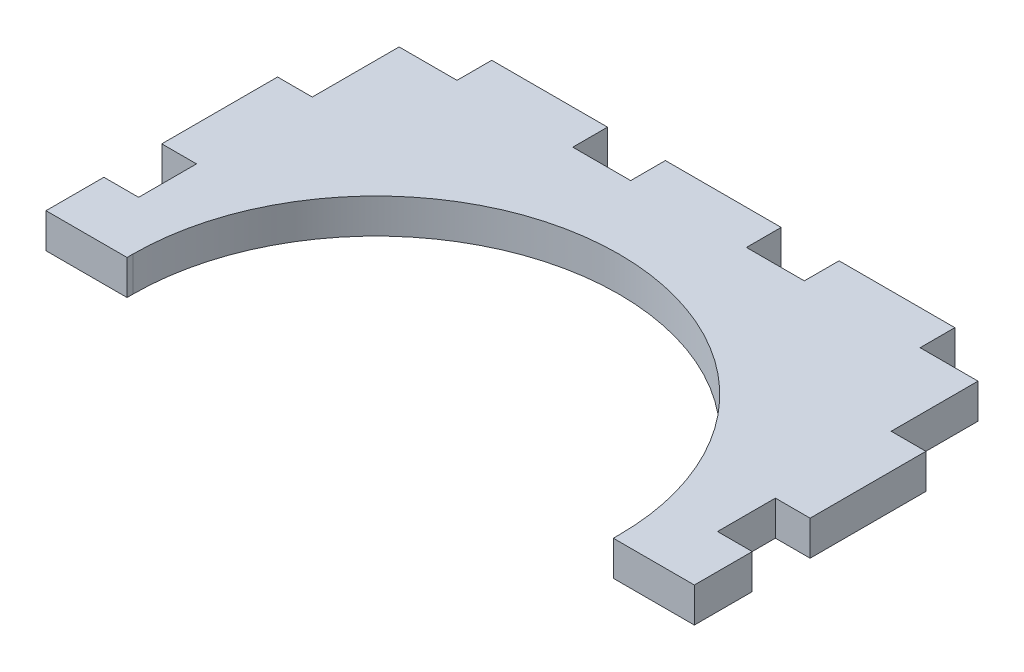
ISO-10303-21;
HEADER;
FILE_DESCRIPTION(('STEP AP214'),'2;1');
FILE_NAME('part.step','',(''),(''),'','','');
FILE_SCHEMA(('AUTOMOTIVE_DESIGN { 1 0 10303 214 1 1 1 1 }'));
ENDSEC;
DATA;
#1=APPLICATION_CONTEXT('core data for automotive mechanical design processes');
#2=APPLICATION_PROTOCOL_DEFINITION('international standard','automotive_design',2000,#1);
#3=PRODUCT_CONTEXT('',#1,'mechanical');
#4=PRODUCT('Part','Part','',(#3));
#5=PRODUCT_RELATED_PRODUCT_CATEGORY('part','',(#4));
#6=PRODUCT_DEFINITION_FORMATION('','',#4);
#7=PRODUCT_DEFINITION_CONTEXT('part definition',#1,'design');
#8=PRODUCT_DEFINITION('design','',#6,#7);
#9=PRODUCT_DEFINITION_SHAPE('','',#8);
#10=(LENGTH_UNIT() NAMED_UNIT(*) SI_UNIT(.MILLI.,.METRE.));
#11=(NAMED_UNIT(*) PLANE_ANGLE_UNIT() SI_UNIT($,.RADIAN.));
#12=(NAMED_UNIT(*) SI_UNIT($,.STERADIAN.) SOLID_ANGLE_UNIT());
#13=UNCERTAINTY_MEASURE_WITH_UNIT(LENGTH_MEASURE(1.E-05),#10,'distance_accuracy_value','');
#14=(GEOMETRIC_REPRESENTATION_CONTEXT(3) GLOBAL_UNCERTAINTY_ASSIGNED_CONTEXT((#13)) GLOBAL_UNIT_ASSIGNED_CONTEXT((#10,
#11,#12)) REPRESENTATION_CONTEXT('',''));
#15=CARTESIAN_POINT('',(0.,0.,0.));
#16=DIRECTION('',(0.,0.,1.));
#17=DIRECTION('',(1.,0.,0.));
#18=AXIS2_PLACEMENT_3D('',#15,#16,#17);
#19=CARTESIAN_POINT('',(-25.,3.,-27.5));
#20=DIRECTION('',(1.,0.,0.));
#21=DIRECTION('',(0.,0.,-1.));
#22=AXIS2_PLACEMENT_3D('',#19,#20,#21);
#23=PLANE('',#22);
#24=DIRECTION('',(0.,0.,1.));
#25=VECTOR('',#24,1.);
#26=CARTESIAN_POINT('',(-25.,0.,-27.5));
#27=LINE('',#26,#25);
#28=CARTESIAN_POINT('',(-25.,0.,-27.5));
#29=VERTEX_POINT('',#28);
#30=CARTESIAN_POINT('',(-25.,0.,-20.));
#31=VERTEX_POINT('',#30);
#32=EDGE_CURVE('E284',#29,#31,#27,.T.);
#33=ORIENTED_EDGE('',*,*,#32,.T.);
#34=DIRECTION('',(0.,-1.,0.));
#35=VECTOR('',#34,1.);
#36=CARTESIAN_POINT('',(-25.,3.,-20.));
#37=LINE('',#36,#35);
#38=CARTESIAN_POINT('',(-25.,3.,-20.));
#39=VERTEX_POINT('',#38);
#40=EDGE_CURVE('E11',#39,#31,#37,.T.);
#41=ORIENTED_EDGE('',*,*,#40,.F.);
#42=DIRECTION('',(0.,0.,1.));
#43=VECTOR('',#42,1.);
#44=CARTESIAN_POINT('',(-25.,3.,-27.5));
#45=LINE('',#44,#43);
#46=CARTESIAN_POINT('',(-25.,3.,-27.5));
#47=VERTEX_POINT('',#46);
#48=EDGE_CURVE('E380',#47,#39,#45,.T.);
#49=ORIENTED_EDGE('',*,*,#48,.F.);
#50=DIRECTION('',(0.,-1.,0.));
#51=VECTOR('',#50,1.);
#52=CARTESIAN_POINT('',(-25.,3.,-27.5));
#53=LINE('',#52,#51);
#54=EDGE_CURVE('E280',#47,#29,#53,.T.);
#55=ORIENTED_EDGE('',*,*,#54,.T.);
#56=EDGE_LOOP('',(#33,#41,#49,#55));
#57=FACE_BOUND('',#56,.T.);
#58=ADVANCED_FACE('F39',(#57),#23,.F.);
#59=CARTESIAN_POINT('',(-25.,3.,-20.));
#60=DIRECTION('',(0.,0.,1.));
#61=DIRECTION('',(1.,0.,0.));
#62=AXIS2_PLACEMENT_3D('',#59,#60,#61);
#63=PLANE('',#62);
#64=DIRECTION('',(-1.,0.,0.));
#65=VECTOR('',#64,1.);
#66=CARTESIAN_POINT('',(-25.,0.,-20.));
#67=LINE('',#66,#65);
#68=CARTESIAN_POINT('',(-28.,0.,-20.));
#69=VERTEX_POINT('',#68);
#70=EDGE_CURVE('E288',#31,#69,#67,.T.);
#71=ORIENTED_EDGE('',*,*,#70,.T.);
#72=DIRECTION('',(0.,-1.,0.));
#73=VECTOR('',#72,1.);
#74=CARTESIAN_POINT('',(-28.,3.,-20.));
#75=LINE('',#74,#73);
#76=CARTESIAN_POINT('',(-28.,3.,-20.));
#77=VERTEX_POINT('',#76);
#78=EDGE_CURVE('E48',#77,#69,#75,.T.);
#79=ORIENTED_EDGE('',*,*,#78,.F.);
#80=DIRECTION('',(-1.,0.,0.));
#81=VECTOR('',#80,1.);
#82=CARTESIAN_POINT('',(-25.,3.,-20.));
#83=LINE('',#82,#81);
#84=EDGE_CURVE('E171',#39,#77,#83,.T.);
#85=ORIENTED_EDGE('',*,*,#84,.F.);
#86=ORIENTED_EDGE('',*,*,#40,.T.);
#87=EDGE_LOOP('',(#71,#79,#85,#86));
#88=FACE_BOUND('',#87,.T.);
#89=ADVANCED_FACE('F614',(#88),#63,.F.);
#90=CARTESIAN_POINT('',(-28.,3.,-20.));
#91=DIRECTION('',(1.,0.,0.));
#92=DIRECTION('',(0.,0.,-1.));
#93=AXIS2_PLACEMENT_3D('',#90,#91,#92);
#94=PLANE('',#93);
#95=DIRECTION('',(0.,0.,1.));
#96=VECTOR('',#95,1.);
#97=CARTESIAN_POINT('',(-28.,0.,-20.));
#98=LINE('',#97,#96);
#99=CARTESIAN_POINT('',(-28.,0.,-10.));
#100=VERTEX_POINT('',#99);
#101=EDGE_CURVE('E291',#69,#100,#98,.T.);
#102=ORIENTED_EDGE('',*,*,#101,.T.);
#103=DIRECTION('',(0.,-1.,0.));
#104=VECTOR('',#103,1.);
#105=CARTESIAN_POINT('',(-28.,3.,-10.));
#106=LINE('',#105,#104);
#107=CARTESIAN_POINT('',(-28.,3.,-10.));
#108=VERTEX_POINT('',#107);
#109=EDGE_CURVE('E487',#108,#100,#106,.T.);
#110=ORIENTED_EDGE('',*,*,#109,.F.);
#111=DIRECTION('',(0.,0.,1.));
#112=VECTOR('',#111,1.);
#113=CARTESIAN_POINT('',(-28.,3.,-20.));
#114=LINE('',#113,#112);
#115=EDGE_CURVE('E497',#77,#108,#114,.T.);
#116=ORIENTED_EDGE('',*,*,#115,.F.);
#117=ORIENTED_EDGE('',*,*,#78,.T.);
#118=EDGE_LOOP('',(#102,#110,#116,#117));
#119=FACE_BOUND('',#118,.T.);
#120=ADVANCED_FACE('F495',(#119),#94,.F.);
#121=CARTESIAN_POINT('',(-25.,3.,-10.));
#122=DIRECTION('',(0.,0.,-1.));
#123=DIRECTION('',(-1.,0.,0.));
#124=AXIS2_PLACEMENT_3D('',#121,#122,#123);
#125=PLANE('',#124);
#126=DIRECTION('',(1.,0.,0.));
#127=VECTOR('',#126,1.);
#128=CARTESIAN_POINT('',(-25.,0.,-10.));
#129=LINE('',#128,#127);
#130=CARTESIAN_POINT('',(-25.,0.,-10.));
#131=VERTEX_POINT('',#130);
#132=EDGE_CURVE('E294',#100,#131,#129,.T.);
#133=ORIENTED_EDGE('',*,*,#132,.T.);
#134=DIRECTION('',(0.,-1.,0.));
#135=VECTOR('',#134,1.);
#136=CARTESIAN_POINT('',(-25.,3.,-10.));
#137=LINE('',#136,#135);
#138=CARTESIAN_POINT('',(-25.,3.,-10.));
#139=VERTEX_POINT('',#138);
#140=EDGE_CURVE('E483',#139,#131,#137,.T.);
#141=ORIENTED_EDGE('',*,*,#140,.F.);
#142=DIRECTION('',(1.,0.,0.));
#143=VECTOR('',#142,1.);
#144=CARTESIAN_POINT('',(-25.,3.,-10.));
#145=LINE('',#144,#143);
#146=EDGE_CURVE('E516',#108,#139,#145,.T.);
#147=ORIENTED_EDGE('',*,*,#146,.F.);
#148=ORIENTED_EDGE('',*,*,#109,.T.);
#149=EDGE_LOOP('',(#133,#141,#147,#148));
#150=FACE_BOUND('',#149,.T.);
#151=ADVANCED_FACE('F506',(#150),#125,.F.);
#152=CARTESIAN_POINT('',(-25.,3.,-10.));
#153=DIRECTION('',(1.,0.,0.));
#154=DIRECTION('',(0.,0.,-1.));
#155=AXIS2_PLACEMENT_3D('',#152,#153,#154);
#156=PLANE('',#155);
#157=DIRECTION('',(0.,0.,1.));
#158=VECTOR('',#157,1.);
#159=CARTESIAN_POINT('',(-25.,0.,-10.));
#160=LINE('',#159,#158);
#161=CARTESIAN_POINT('',(-24.9999999999998,0.,-5.00000000000001));
#162=VERTEX_POINT('',#161);
#163=EDGE_CURVE('E297',#131,#162,#160,.T.);
#164=ORIENTED_EDGE('',*,*,#163,.T.);
#165=DIRECTION('',(0.,-1.,0.));
#166=VECTOR('',#165,1.);
#167=CARTESIAN_POINT('',(-24.9999999999998,3.,-5.00000000000001));
#168=LINE('',#167,#166);
#169=CARTESIAN_POINT('',(-24.9999999999998,3.,-5.00000000000001));
#170=VERTEX_POINT('',#169);
#171=EDGE_CURVE('E479',#170,#162,#168,.T.);
#172=ORIENTED_EDGE('',*,*,#171,.F.);
#173=DIRECTION('',(0.,0.,1.));
#174=VECTOR('',#173,1.);
#175=CARTESIAN_POINT('',(-25.,3.,-10.));
#176=LINE('',#175,#174);
#177=EDGE_CURVE('E512',#139,#170,#176,.T.);
#178=ORIENTED_EDGE('',*,*,#177,.F.);
#179=ORIENTED_EDGE('',*,*,#140,.T.);
#180=EDGE_LOOP('',(#164,#172,#178,#179));
#181=FACE_BOUND('',#180,.T.);
#182=ADVANCED_FACE('F510',(#181),#156,.F.);
#183=CARTESIAN_POINT('',(-24.9999999999998,3.,-5.00000000000001));
#184=DIRECTION('',(0.,0.,1.));
#185=DIRECTION('',(1.,0.,0.));
#186=AXIS2_PLACEMENT_3D('',#183,#184,#185);
#187=PLANE('',#186);
#188=DIRECTION('',(-1.,0.,0.));
#189=VECTOR('',#188,1.);
#190=CARTESIAN_POINT('',(-24.9999999999998,0.,-5.00000000000001));
#191=LINE('',#190,#189);
#192=CARTESIAN_POINT('',(-27.9999999999998,0.,-5.00000000000001));
#193=VERTEX_POINT('',#192);
#194=EDGE_CURVE('E300',#162,#193,#191,.T.);
#195=ORIENTED_EDGE('',*,*,#194,.T.);
#196=DIRECTION('',(0.,-1.,0.));
#197=VECTOR('',#196,1.);
#198=CARTESIAN_POINT('',(-27.9999999999998,3.,-5.00000000000001));
#199=LINE('',#198,#197);
#200=CARTESIAN_POINT('',(-27.9999999999998,3.,-5.00000000000001));
#201=VERTEX_POINT('',#200);
#202=EDGE_CURVE('E475',#201,#193,#199,.T.);
#203=ORIENTED_EDGE('',*,*,#202,.F.);
#204=DIRECTION('',(-1.,0.,0.));
#205=VECTOR('',#204,1.);
#206=CARTESIAN_POINT('',(-24.9999999999998,3.,-5.00000000000001));
#207=LINE('',#206,#205);
#208=EDGE_CURVE('E515',#170,#201,#207,.T.);
#209=ORIENTED_EDGE('',*,*,#208,.F.);
#210=ORIENTED_EDGE('',*,*,#171,.T.);
#211=EDGE_LOOP('',(#195,#203,#209,#210));
#212=FACE_BOUND('',#211,.T.);
#213=ADVANCED_FACE('F627',(#212),#187,.F.);
#214=CARTESIAN_POINT('',(-27.9999999999998,3.,-0.500000000000007));
#215=DIRECTION('',(1.,0.,0.));
#216=DIRECTION('',(0.,0.,-1.));
#217=AXIS2_PLACEMENT_3D('',#214,#215,#216);
#218=PLANE('',#217);
#219=DIRECTION('',(0.,0.,1.));
#220=VECTOR('',#219,1.);
#221=CARTESIAN_POINT('',(-27.9999999999998,0.,-0.500000000000007));
#222=LINE('',#221,#220);
#223=CARTESIAN_POINT('',(-27.9999999999998,0.,0.));
#224=VERTEX_POINT('',#223);
#225=EDGE_CURVE('E304',#193,#224,#222,.T.);
#226=ORIENTED_EDGE('',*,*,#225,.T.);
#227=DIRECTION('',(0.,-1.,0.));
#228=VECTOR('',#227,1.);
#229=CARTESIAN_POINT('',(-27.9999999999998,3.,0.));
#230=LINE('',#229,#228);
#231=CARTESIAN_POINT('',(-27.9999999999998,3.,0.));
#232=VERTEX_POINT('',#231);
#233=EDGE_CURVE('E471',#232,#224,#230,.T.);
#234=ORIENTED_EDGE('',*,*,#233,.F.);
#235=DIRECTION('',(0.,0.,1.));
#236=VECTOR('',#235,1.);
#237=CARTESIAN_POINT('',(-27.9999999999998,3.,-5.00000000000001));
#238=LINE('',#237,#236);
#239=EDGE_CURVE('E520',#201,#232,#238,.T.);
#240=ORIENTED_EDGE('',*,*,#239,.F.);
#241=ORIENTED_EDGE('',*,*,#202,.T.);
#242=EDGE_LOOP('',(#226,#234,#240,#241));
#243=FACE_BOUND('',#242,.T.);
#244=ADVANCED_FACE('F630',(#243),#218,.F.);
#245=CARTESIAN_POINT('',(-27.9999999999998,3.,0.));
#246=DIRECTION('',(0.,0.,-1.));
#247=DIRECTION('',(-1.,0.,0.));
#248=AXIS2_PLACEMENT_3D('',#245,#246,#247);
#249=PLANE('',#248);
#250=DIRECTION('',(1.,0.,0.));
#251=VECTOR('',#250,1.);
#252=CARTESIAN_POINT('',(-27.9999999999998,0.,0.));
#253=LINE('',#252,#251);
#254=CARTESIAN_POINT('',(-21.,0.,0.));
#255=VERTEX_POINT('',#254);
#256=EDGE_CURVE('E307',#224,#255,#253,.T.);
#257=ORIENTED_EDGE('',*,*,#256,.T.);
#258=DIRECTION('',(0.,-1.,0.));
#259=VECTOR('',#258,1.);
#260=CARTESIAN_POINT('',(-21.,3.,0.));
#261=LINE('',#260,#259);
#262=CARTESIAN_POINT('',(-21.,3.,0.));
#263=VERTEX_POINT('',#262);
#264=EDGE_CURVE('E467',#263,#255,#261,.T.);
#265=ORIENTED_EDGE('',*,*,#264,.F.);
#266=DIRECTION('',(1.,0.,0.));
#267=VECTOR('',#266,1.);
#268=CARTESIAN_POINT('',(-27.9999999999998,3.,0.));
#269=LINE('',#268,#267);
#270=EDGE_CURVE('E527',#232,#263,#269,.T.);
#271=ORIENTED_EDGE('',*,*,#270,.F.);
#272=ORIENTED_EDGE('',*,*,#233,.T.);
#273=EDGE_LOOP('',(#257,#265,#271,#272));
#274=FACE_BOUND('',#273,.T.);
#275=ADVANCED_FACE('F634',(#274),#249,.F.);
#276=CARTESIAN_POINT('',(-21.,3.,0.));
#277=DIRECTION('',(-1.,0.,0.));
#278=DIRECTION('',(0.,0.,1.));
#279=AXIS2_PLACEMENT_3D('',#276,#277,#278);
#280=PLANE('',#279);
#281=DIRECTION('',(0.,0.,-1.));
#282=VECTOR('',#281,1.);
#283=CARTESIAN_POINT('',(-21.,0.,0.));
#284=LINE('',#283,#282);
#285=CARTESIAN_POINT('',(-21.,0.,-0.500000000000011));
#286=VERTEX_POINT('',#285);
#287=EDGE_CURVE('E310',#255,#286,#284,.T.);
#288=ORIENTED_EDGE('',*,*,#287,.T.);
#289=DIRECTION('',(0.,-1.,0.));
#290=VECTOR('',#289,1.);
#291=CARTESIAN_POINT('',(-21.,3.,-0.500000000000011));
#292=LINE('',#291,#290);
#293=CARTESIAN_POINT('',(-21.,3.,-0.500000000000011));
#294=VERTEX_POINT('',#293);
#295=EDGE_CURVE('E463',#294,#286,#292,.T.);
#296=ORIENTED_EDGE('',*,*,#295,.F.);
#297=DIRECTION('',(0.,0.,-1.));
#298=VECTOR('',#297,1.);
#299=CARTESIAN_POINT('',(-21.,3.,0.));
#300=LINE('',#299,#298);
#301=EDGE_CURVE('E530',#263,#294,#300,.T.);
#302=ORIENTED_EDGE('',*,*,#301,.F.);
#303=ORIENTED_EDGE('',*,*,#264,.T.);
#304=EDGE_LOOP('',(#288,#296,#302,#303));
#305=FACE_BOUND('',#304,.T.);
#306=ADVANCED_FACE('F638',(#305),#280,.F.);
#307=CARTESIAN_POINT('',(0.,3.,-0.500000000000007));
#308=DIRECTION('',(0.,-1.,0.));
#309=DIRECTION('',(0.,0.,-1.));
#310=AXIS2_PLACEMENT_3D('',#307,#308,#309);
#311=CYLINDRICAL_SURFACE('',#310,21.);
#312=CARTESIAN_POINT('',(0.,0.,-0.500000000000007));
#313=DIRECTION('',(0.,-1.,0.));
#314=DIRECTION('',(0.,0.,1.));
#315=AXIS2_PLACEMENT_3D('',#312,#313,#314);
#316=CIRCLE('',#315,21.);
#317=CARTESIAN_POINT('',(21.,0.,-0.500000000000007));
#318=VERTEX_POINT('',#317);
#319=EDGE_CURVE('E313',#286,#318,#316,.T.);
#320=ORIENTED_EDGE('',*,*,#319,.T.);
#321=DIRECTION('',(0.,-1.,0.));
#322=VECTOR('',#321,1.);
#323=CARTESIAN_POINT('',(21.,3.,-0.500000000000007));
#324=LINE('',#323,#322);
#325=CARTESIAN_POINT('',(21.,3.,-0.500000000000007));
#326=VERTEX_POINT('',#325);
#327=EDGE_CURVE('E459',#326,#318,#324,.T.);
#328=ORIENTED_EDGE('',*,*,#327,.F.);
#329=CARTESIAN_POINT('',(0.,3.,-0.500000000000007));
#330=DIRECTION('',(0.,-1.,0.));
#331=DIRECTION('',(0.,0.,1.));
#332=AXIS2_PLACEMENT_3D('',#329,#330,#331);
#333=CIRCLE('',#332,21.);
#334=EDGE_CURVE('E533',#294,#326,#333,.T.);
#335=ORIENTED_EDGE('',*,*,#334,.F.);
#336=ORIENTED_EDGE('',*,*,#295,.T.);
#337=EDGE_LOOP('',(#320,#328,#335,#336));
#338=FACE_BOUND('',#337,.T.);
#339=ADVANCED_FACE('F642',(#338),#311,.F.);
#340=CARTESIAN_POINT('',(21.,3.,-0.500000000000007));
#341=DIRECTION('',(1.,0.,0.));
#342=DIRECTION('',(0.,0.,-1.));
#343=AXIS2_PLACEMENT_3D('',#340,#341,#342);
#344=PLANE('',#343);
#345=DIRECTION('',(0.,0.,1.));
#346=VECTOR('',#345,1.);
#347=CARTESIAN_POINT('',(21.,0.,-0.500000000000007));
#348=LINE('',#347,#346);
#349=CARTESIAN_POINT('',(21.,0.,0.));
#350=VERTEX_POINT('',#349);
#351=EDGE_CURVE('E316',#318,#350,#348,.T.);
#352=ORIENTED_EDGE('',*,*,#351,.T.);
#353=DIRECTION('',(0.,-1.,0.));
#354=VECTOR('',#353,1.);
#355=CARTESIAN_POINT('',(21.,3.,0.));
#356=LINE('',#355,#354);
#357=CARTESIAN_POINT('',(21.,3.,0.));
#358=VERTEX_POINT('',#357);
#359=EDGE_CURVE('E455',#358,#350,#356,.T.);
#360=ORIENTED_EDGE('',*,*,#359,.F.);
#361=DIRECTION('',(0.,0.,1.));
#362=VECTOR('',#361,1.);
#363=CARTESIAN_POINT('',(21.,3.,-0.500000000000007));
#364=LINE('',#363,#362);
#365=EDGE_CURVE('E536',#326,#358,#364,.T.);
#366=ORIENTED_EDGE('',*,*,#365,.F.);
#367=ORIENTED_EDGE('',*,*,#327,.T.);
#368=EDGE_LOOP('',(#352,#360,#366,#367));
#369=FACE_BOUND('',#368,.T.);
#370=ADVANCED_FACE('F646',(#369),#344,.F.);
#371=CARTESIAN_POINT('',(21.,3.,0.));
#372=DIRECTION('',(0.,0.,-1.));
#373=DIRECTION('',(-1.,0.,0.));
#374=AXIS2_PLACEMENT_3D('',#371,#372,#373);
#375=PLANE('',#374);
#376=DIRECTION('',(1.,0.,0.));
#377=VECTOR('',#376,1.);
#378=CARTESIAN_POINT('',(21.,0.,0.));
#379=LINE('',#378,#377);
#380=CARTESIAN_POINT('',(27.9999999999998,0.,0.));
#381=VERTEX_POINT('',#380);
#382=EDGE_CURVE('E319',#350,#381,#379,.T.);
#383=ORIENTED_EDGE('',*,*,#382,.T.);
#384=DIRECTION('',(0.,-1.,0.));
#385=VECTOR('',#384,1.);
#386=CARTESIAN_POINT('',(27.9999999999998,3.,0.));
#387=LINE('',#386,#385);
#388=CARTESIAN_POINT('',(27.9999999999998,3.,0.));
#389=VERTEX_POINT('',#388);
#390=EDGE_CURVE('E451',#389,#381,#387,.T.);
#391=ORIENTED_EDGE('',*,*,#390,.F.);
#392=DIRECTION('',(1.,0.,0.));
#393=VECTOR('',#392,1.);
#394=CARTESIAN_POINT('',(21.,3.,0.));
#395=LINE('',#394,#393);
#396=EDGE_CURVE('E539',#358,#389,#395,.T.);
#397=ORIENTED_EDGE('',*,*,#396,.F.);
#398=ORIENTED_EDGE('',*,*,#359,.T.);
#399=EDGE_LOOP('',(#383,#391,#397,#398));
#400=FACE_BOUND('',#399,.T.);
#401=ADVANCED_FACE('F650',(#400),#375,.F.);
#402=CARTESIAN_POINT('',(27.9999999999998,3.,-5.00000000000001));
#403=DIRECTION('',(-1.,0.,0.));
#404=DIRECTION('',(0.,0.,1.));
#405=AXIS2_PLACEMENT_3D('',#402,#403,#404);
#406=PLANE('',#405);
#407=DIRECTION('',(0.,0.,-1.));
#408=VECTOR('',#407,1.);
#409=CARTESIAN_POINT('',(27.9999999999998,0.,-5.00000000000001));
#410=LINE('',#409,#408);
#411=CARTESIAN_POINT('',(27.9999999999998,0.,-5.00000000000001));
#412=VERTEX_POINT('',#411);
#413=EDGE_CURVE('E323',#381,#412,#410,.T.);
#414=ORIENTED_EDGE('',*,*,#413,.T.);
#415=DIRECTION('',(0.,-1.,0.));
#416=VECTOR('',#415,1.);
#417=CARTESIAN_POINT('',(27.9999999999998,3.,-5.00000000000001));
#418=LINE('',#417,#416);
#419=CARTESIAN_POINT('',(27.9999999999998,3.,-5.00000000000001));
#420=VERTEX_POINT('',#419);
#421=EDGE_CURVE('E447',#420,#412,#418,.T.);
#422=ORIENTED_EDGE('',*,*,#421,.F.);
#423=DIRECTION('',(0.,0.,-1.));
#424=VECTOR('',#423,1.);
#425=CARTESIAN_POINT('',(27.9999999999998,3.,0.));
#426=LINE('',#425,#424);
#427=EDGE_CURVE('E542',#389,#420,#426,.T.);
#428=ORIENTED_EDGE('',*,*,#427,.F.);
#429=ORIENTED_EDGE('',*,*,#390,.T.);
#430=EDGE_LOOP('',(#414,#422,#428,#429));
#431=FACE_BOUND('',#430,.T.);
#432=ADVANCED_FACE('F654',(#431),#406,.F.);
#433=CARTESIAN_POINT('',(24.9999999999998,3.,-5.00000000000001));
#434=DIRECTION('',(0.,0.,1.));
#435=DIRECTION('',(1.,0.,0.));
#436=AXIS2_PLACEMENT_3D('',#433,#434,#435);
#437=PLANE('',#436);
#438=DIRECTION('',(-1.,0.,0.));
#439=VECTOR('',#438,1.);
#440=CARTESIAN_POINT('',(24.9999999999998,0.,-5.00000000000001));
#441=LINE('',#440,#439);
#442=CARTESIAN_POINT('',(24.9999999999998,0.,-5.00000000000001));
#443=VERTEX_POINT('',#442);
#444=EDGE_CURVE('E326',#412,#443,#441,.T.);
#445=ORIENTED_EDGE('',*,*,#444,.T.);
#446=DIRECTION('',(0.,-1.,0.));
#447=VECTOR('',#446,1.);
#448=CARTESIAN_POINT('',(24.9999999999998,3.,-5.00000000000001));
#449=LINE('',#448,#447);
#450=CARTESIAN_POINT('',(24.9999999999998,3.,-5.00000000000001));
#451=VERTEX_POINT('',#450);
#452=EDGE_CURVE('E443',#451,#443,#449,.T.);
#453=ORIENTED_EDGE('',*,*,#452,.F.);
#454=DIRECTION('',(-1.,0.,0.));
#455=VECTOR('',#454,1.);
#456=CARTESIAN_POINT('',(24.9999999999998,3.,-5.00000000000001));
#457=LINE('',#456,#455);
#458=EDGE_CURVE('E545',#420,#451,#457,.T.);
#459=ORIENTED_EDGE('',*,*,#458,.F.);
#460=ORIENTED_EDGE('',*,*,#421,.T.);
#461=EDGE_LOOP('',(#445,#453,#459,#460));
#462=FACE_BOUND('',#461,.T.);
#463=ADVANCED_FACE('F658',(#462),#437,.F.);
#464=CARTESIAN_POINT('',(25.,3.,-10.));
#465=DIRECTION('',(-1.,0.,0.));
#466=DIRECTION('',(0.,0.,1.));
#467=AXIS2_PLACEMENT_3D('',#464,#465,#466);
#468=PLANE('',#467);
#469=DIRECTION('',(0.,0.,-1.));
#470=VECTOR('',#469,1.);
#471=CARTESIAN_POINT('',(25.,0.,-10.));
#472=LINE('',#471,#470);
#473=CARTESIAN_POINT('',(25.,0.,-10.));
#474=VERTEX_POINT('',#473);
#475=EDGE_CURVE('E329',#443,#474,#472,.T.);
#476=ORIENTED_EDGE('',*,*,#475,.T.);
#477=DIRECTION('',(0.,-1.,0.));
#478=VECTOR('',#477,1.);
#479=CARTESIAN_POINT('',(25.,3.,-10.));
#480=LINE('',#479,#478);
#481=CARTESIAN_POINT('',(25.,3.,-10.));
#482=VERTEX_POINT('',#481);
#483=EDGE_CURVE('E439',#482,#474,#480,.T.);
#484=ORIENTED_EDGE('',*,*,#483,.F.);
#485=DIRECTION('',(0.,0.,-1.));
#486=VECTOR('',#485,1.);
#487=CARTESIAN_POINT('',(25.,3.,-10.));
#488=LINE('',#487,#486);
#489=EDGE_CURVE('E548',#451,#482,#488,.T.);
#490=ORIENTED_EDGE('',*,*,#489,.F.);
#491=ORIENTED_EDGE('',*,*,#452,.T.);
#492=EDGE_LOOP('',(#476,#484,#490,#491));
#493=FACE_BOUND('',#492,.T.);
#494=ADVANCED_FACE('F662',(#493),#468,.F.);
#495=CARTESIAN_POINT('',(25.,3.,-10.));
#496=DIRECTION('',(0.,0.,-1.));
#497=DIRECTION('',(-1.,0.,0.));
#498=AXIS2_PLACEMENT_3D('',#495,#496,#497);
#499=PLANE('',#498);
#500=DIRECTION('',(1.,0.,0.));
#501=VECTOR('',#500,1.);
#502=CARTESIAN_POINT('',(25.,0.,-10.));
#503=LINE('',#502,#501);
#504=CARTESIAN_POINT('',(28.,0.,-10.));
#505=VERTEX_POINT('',#504);
#506=EDGE_CURVE('E332',#474,#505,#503,.T.);
#507=ORIENTED_EDGE('',*,*,#506,.T.);
#508=DIRECTION('',(0.,-1.,0.));
#509=VECTOR('',#508,1.);
#510=CARTESIAN_POINT('',(28.,3.,-10.));
#511=LINE('',#510,#509);
#512=CARTESIAN_POINT('',(28.,3.,-10.));
#513=VERTEX_POINT('',#512);
#514=EDGE_CURVE('E435',#513,#505,#511,.T.);
#515=ORIENTED_EDGE('',*,*,#514,.F.);
#516=DIRECTION('',(1.,0.,0.));
#517=VECTOR('',#516,1.);
#518=CARTESIAN_POINT('',(25.,3.,-10.));
#519=LINE('',#518,#517);
#520=EDGE_CURVE('E551',#482,#513,#519,.T.);
#521=ORIENTED_EDGE('',*,*,#520,.F.);
#522=ORIENTED_EDGE('',*,*,#483,.T.);
#523=EDGE_LOOP('',(#507,#515,#521,#522));
#524=FACE_BOUND('',#523,.T.);
#525=ADVANCED_FACE('F666',(#524),#499,.F.);
#526=CARTESIAN_POINT('',(28.,3.,-20.));
#527=DIRECTION('',(-1.,0.,0.));
#528=DIRECTION('',(0.,0.,1.));
#529=AXIS2_PLACEMENT_3D('',#526,#527,#528);
#530=PLANE('',#529);
#531=DIRECTION('',(0.,0.,-1.));
#532=VECTOR('',#531,1.);
#533=CARTESIAN_POINT('',(28.,0.,-20.));
#534=LINE('',#533,#532);
#535=CARTESIAN_POINT('',(28.,0.,-20.));
#536=VERTEX_POINT('',#535);
#537=EDGE_CURVE('E335',#505,#536,#534,.T.);
#538=ORIENTED_EDGE('',*,*,#537,.T.);
#539=DIRECTION('',(0.,-1.,0.));
#540=VECTOR('',#539,1.);
#541=CARTESIAN_POINT('',(28.,3.,-20.));
#542=LINE('',#541,#540);
#543=CARTESIAN_POINT('',(28.,3.,-20.));
#544=VERTEX_POINT('',#543);
#545=EDGE_CURVE('E431',#544,#536,#542,.T.);
#546=ORIENTED_EDGE('',*,*,#545,.F.);
#547=DIRECTION('',(0.,0.,-1.));
#548=VECTOR('',#547,1.);
#549=CARTESIAN_POINT('',(28.,3.,-20.));
#550=LINE('',#549,#548);
#551=EDGE_CURVE('E554',#513,#544,#550,.T.);
#552=ORIENTED_EDGE('',*,*,#551,.F.);
#553=ORIENTED_EDGE('',*,*,#514,.T.);
#554=EDGE_LOOP('',(#538,#546,#552,#553));
#555=FACE_BOUND('',#554,.T.);
#556=ADVANCED_FACE('F670',(#555),#530,.F.);
#557=CARTESIAN_POINT('',(25.,3.,-20.));
#558=DIRECTION('',(0.,0.,1.));
#559=DIRECTION('',(1.,0.,0.));
#560=AXIS2_PLACEMENT_3D('',#557,#558,#559);
#561=PLANE('',#560);
#562=DIRECTION('',(-1.,0.,0.));
#563=VECTOR('',#562,1.);
#564=CARTESIAN_POINT('',(25.,0.,-20.));
#565=LINE('',#564,#563);
#566=CARTESIAN_POINT('',(25.,0.,-20.));
#567=VERTEX_POINT('',#566);
#568=EDGE_CURVE('E338',#536,#567,#565,.T.);
#569=ORIENTED_EDGE('',*,*,#568,.T.);
#570=DIRECTION('',(0.,-1.,0.));
#571=VECTOR('',#570,1.);
#572=CARTESIAN_POINT('',(25.,3.,-20.));
#573=LINE('',#572,#571);
#574=CARTESIAN_POINT('',(25.,3.,-20.));
#575=VERTEX_POINT('',#574);
#576=EDGE_CURVE('E427',#575,#567,#573,.T.);
#577=ORIENTED_EDGE('',*,*,#576,.F.);
#578=DIRECTION('',(-1.,0.,0.));
#579=VECTOR('',#578,1.);
#580=CARTESIAN_POINT('',(25.,3.,-20.));
#581=LINE('',#580,#579);
#582=EDGE_CURVE('E557',#544,#575,#581,.T.);
#583=ORIENTED_EDGE('',*,*,#582,.F.);
#584=ORIENTED_EDGE('',*,*,#545,.T.);
#585=EDGE_LOOP('',(#569,#577,#583,#584));
#586=FACE_BOUND('',#585,.T.);
#587=ADVANCED_FACE('F674',(#586),#561,.F.);
#588=CARTESIAN_POINT('',(25.,3.,-27.5));
#589=DIRECTION('',(-1.,0.,0.));
#590=DIRECTION('',(0.,0.,1.));
#591=AXIS2_PLACEMENT_3D('',#588,#589,#590);
#592=PLANE('',#591);
#593=DIRECTION('',(0.,0.,-1.));
#594=VECTOR('',#593,1.);
#595=CARTESIAN_POINT('',(25.,0.,-27.5));
#596=LINE('',#595,#594);
#597=CARTESIAN_POINT('',(25.,0.,-27.5));
#598=VERTEX_POINT('',#597);
#599=EDGE_CURVE('E341',#567,#598,#596,.T.);
#600=ORIENTED_EDGE('',*,*,#599,.T.);
#601=DIRECTION('',(0.,-1.,0.));
#602=VECTOR('',#601,1.);
#603=CARTESIAN_POINT('',(25.,3.,-27.5));
#604=LINE('',#603,#602);
#605=CARTESIAN_POINT('',(25.,3.,-27.5));
#606=VERTEX_POINT('',#605);
#607=EDGE_CURVE('E423',#606,#598,#604,.T.);
#608=ORIENTED_EDGE('',*,*,#607,.F.);
#609=DIRECTION('',(0.,0.,-1.));
#610=VECTOR('',#609,1.);
#611=CARTESIAN_POINT('',(25.,3.,-27.5));
#612=LINE('',#611,#610);
#613=EDGE_CURVE('E560',#575,#606,#612,.T.);
#614=ORIENTED_EDGE('',*,*,#613,.F.);
#615=ORIENTED_EDGE('',*,*,#576,.T.);
#616=EDGE_LOOP('',(#600,#608,#614,#615));
#617=FACE_BOUND('',#616,.T.);
#618=ADVANCED_FACE('F678',(#617),#592,.F.);
#619=CARTESIAN_POINT('',(20.,3.,-27.5));
#620=DIRECTION('',(0.,0.,1.));
#621=DIRECTION('',(1.,0.,0.));
#622=AXIS2_PLACEMENT_3D('',#619,#620,#621);
#623=PLANE('',#622);
#624=DIRECTION('',(-1.,0.,0.));
#625=VECTOR('',#624,1.);
#626=CARTESIAN_POINT('',(20.,0.,-27.5));
#627=LINE('',#626,#625);
#628=CARTESIAN_POINT('',(20.,0.,-27.5));
#629=VERTEX_POINT('',#628);
#630=EDGE_CURVE('E344',#598,#629,#627,.T.);
#631=ORIENTED_EDGE('',*,*,#630,.T.);
#632=DIRECTION('',(0.,-1.,0.));
#633=VECTOR('',#632,1.);
#634=CARTESIAN_POINT('',(20.,3.,-27.5));
#635=LINE('',#634,#633);
#636=CARTESIAN_POINT('',(20.,3.,-27.5));
#637=VERTEX_POINT('',#636);
#638=EDGE_CURVE('E419',#637,#629,#635,.T.);
#639=ORIENTED_EDGE('',*,*,#638,.F.);
#640=DIRECTION('',(-1.,0.,0.));
#641=VECTOR('',#640,1.);
#642=CARTESIAN_POINT('',(20.,3.,-27.5));
#643=LINE('',#642,#641);
#644=EDGE_CURVE('E563',#606,#637,#643,.T.);
#645=ORIENTED_EDGE('',*,*,#644,.F.);
#646=ORIENTED_EDGE('',*,*,#607,.T.);
#647=EDGE_LOOP('',(#631,#639,#645,#646));
#648=FACE_BOUND('',#647,.T.);
#649=ADVANCED_FACE('F682',(#648),#623,.F.);
#650=CARTESIAN_POINT('',(20.,3.,-27.5));
#651=DIRECTION('',(-1.,0.,0.));
#652=DIRECTION('',(0.,0.,1.));
#653=AXIS2_PLACEMENT_3D('',#650,#651,#652);
#654=PLANE('',#653);
#655=DIRECTION('',(0.,0.,-1.));
#656=VECTOR('',#655,1.);
#657=CARTESIAN_POINT('',(20.,0.,-27.5));
#658=LINE('',#657,#656);
#659=CARTESIAN_POINT('',(20.,0.,-30.5));
#660=VERTEX_POINT('',#659);
#661=EDGE_CURVE('E347',#629,#660,#658,.T.);
#662=ORIENTED_EDGE('',*,*,#661,.T.);
#663=DIRECTION('',(0.,-1.,0.));
#664=VECTOR('',#663,1.);
#665=CARTESIAN_POINT('',(20.,3.,-30.5));
#666=LINE('',#665,#664);
#667=CARTESIAN_POINT('',(20.,3.,-30.5));
#668=VERTEX_POINT('',#667);
#669=EDGE_CURVE('E415',#668,#660,#666,.T.);
#670=ORIENTED_EDGE('',*,*,#669,.F.);
#671=DIRECTION('',(0.,0.,-1.));
#672=VECTOR('',#671,1.);
#673=CARTESIAN_POINT('',(20.,3.,-27.5));
#674=LINE('',#673,#672);
#675=EDGE_CURVE('E566',#637,#668,#674,.T.);
#676=ORIENTED_EDGE('',*,*,#675,.F.);
#677=ORIENTED_EDGE('',*,*,#638,.T.);
#678=EDGE_LOOP('',(#662,#670,#676,#677));
#679=FACE_BOUND('',#678,.T.);
#680=ADVANCED_FACE('F686',(#679),#654,.F.);
#681=CARTESIAN_POINT('',(10.,3.,-30.5));
#682=DIRECTION('',(0.,0.,1.));
#683=DIRECTION('',(1.,0.,0.));
#684=AXIS2_PLACEMENT_3D('',#681,#682,#683);
#685=PLANE('',#684);
#686=DIRECTION('',(-1.,0.,0.));
#687=VECTOR('',#686,1.);
#688=CARTESIAN_POINT('',(10.,0.,-30.5));
#689=LINE('',#688,#687);
#690=CARTESIAN_POINT('',(10.,0.,-30.5));
#691=VERTEX_POINT('',#690);
#692=EDGE_CURVE('E350',#660,#691,#689,.T.);
#693=ORIENTED_EDGE('',*,*,#692,.T.);
#694=DIRECTION('',(0.,-1.,0.));
#695=VECTOR('',#694,1.);
#696=CARTESIAN_POINT('',(10.,3.,-30.5));
#697=LINE('',#696,#695);
#698=CARTESIAN_POINT('',(10.,3.,-30.5));
#699=VERTEX_POINT('',#698);
#700=EDGE_CURVE('E411',#699,#691,#697,.T.);
#701=ORIENTED_EDGE('',*,*,#700,.F.);
#702=DIRECTION('',(-1.,0.,0.));
#703=VECTOR('',#702,1.);
#704=CARTESIAN_POINT('',(10.,3.,-30.5));
#705=LINE('',#704,#703);
#706=EDGE_CURVE('E569',#668,#699,#705,.T.);
#707=ORIENTED_EDGE('',*,*,#706,.F.);
#708=ORIENTED_EDGE('',*,*,#669,.T.);
#709=EDGE_LOOP('',(#693,#701,#707,#708));
#710=FACE_BOUND('',#709,.T.);
#711=ADVANCED_FACE('F690',(#710),#685,.F.);
#712=CARTESIAN_POINT('',(10.,3.,-27.5));
#713=DIRECTION('',(1.,0.,0.));
#714=DIRECTION('',(0.,0.,-1.));
#715=AXIS2_PLACEMENT_3D('',#712,#713,#714);
#716=PLANE('',#715);
#717=DIRECTION('',(0.,0.,1.));
#718=VECTOR('',#717,1.);
#719=CARTESIAN_POINT('',(10.,0.,-27.5));
#720=LINE('',#719,#718);
#721=CARTESIAN_POINT('',(10.,0.,-27.5));
#722=VERTEX_POINT('',#721);
#723=EDGE_CURVE('E353',#691,#722,#720,.T.);
#724=ORIENTED_EDGE('',*,*,#723,.T.);
#725=DIRECTION('',(0.,-1.,0.));
#726=VECTOR('',#725,1.);
#727=CARTESIAN_POINT('',(10.,3.,-27.5));
#728=LINE('',#727,#726);
#729=CARTESIAN_POINT('',(10.,3.,-27.5));
#730=VERTEX_POINT('',#729);
#731=EDGE_CURVE('E407',#730,#722,#728,.T.);
#732=ORIENTED_EDGE('',*,*,#731,.F.);
#733=DIRECTION('',(0.,0.,1.));
#734=VECTOR('',#733,1.);
#735=CARTESIAN_POINT('',(10.,3.,-27.5));
#736=LINE('',#735,#734);
#737=EDGE_CURVE('E572',#699,#730,#736,.T.);
#738=ORIENTED_EDGE('',*,*,#737,.F.);
#739=ORIENTED_EDGE('',*,*,#700,.T.);
#740=EDGE_LOOP('',(#724,#732,#738,#739));
#741=FACE_BOUND('',#740,.T.);
#742=ADVANCED_FACE('F694',(#741),#716,.F.);
#743=CARTESIAN_POINT('',(5.,3.,-27.5));
#744=DIRECTION('',(0.,0.,1.));
#745=DIRECTION('',(1.,0.,0.));
#746=AXIS2_PLACEMENT_3D('',#743,#744,#745);
#747=PLANE('',#746);
#748=DIRECTION('',(-1.,0.,0.));
#749=VECTOR('',#748,1.);
#750=CARTESIAN_POINT('',(5.,0.,-27.5));
#751=LINE('',#750,#749);
#752=CARTESIAN_POINT('',(5.,0.,-27.5));
#753=VERTEX_POINT('',#752);
#754=EDGE_CURVE('E356',#722,#753,#751,.T.);
#755=ORIENTED_EDGE('',*,*,#754,.T.);
#756=DIRECTION('',(0.,-1.,0.));
#757=VECTOR('',#756,1.);
#758=CARTESIAN_POINT('',(5.,3.,-27.5));
#759=LINE('',#758,#757);
#760=CARTESIAN_POINT('',(5.,3.,-27.5));
#761=VERTEX_POINT('',#760);
#762=EDGE_CURVE('E403',#761,#753,#759,.T.);
#763=ORIENTED_EDGE('',*,*,#762,.F.);
#764=DIRECTION('',(-1.,0.,0.));
#765=VECTOR('',#764,1.);
#766=CARTESIAN_POINT('',(5.,3.,-27.5));
#767=LINE('',#766,#765);
#768=EDGE_CURVE('E575',#730,#761,#767,.T.);
#769=ORIENTED_EDGE('',*,*,#768,.F.);
#770=ORIENTED_EDGE('',*,*,#731,.T.);
#771=EDGE_LOOP('',(#755,#763,#769,#770));
#772=FACE_BOUND('',#771,.T.);
#773=ADVANCED_FACE('F698',(#772),#747,.F.);
#774=CARTESIAN_POINT('',(5.,3.,-27.5));
#775=DIRECTION('',(-1.,0.,0.));
#776=DIRECTION('',(0.,0.,1.));
#777=AXIS2_PLACEMENT_3D('',#774,#775,#776);
#778=PLANE('',#777);
#779=DIRECTION('',(0.,0.,-1.));
#780=VECTOR('',#779,1.);
#781=CARTESIAN_POINT('',(5.,0.,-27.5));
#782=LINE('',#781,#780);
#783=CARTESIAN_POINT('',(5.,0.,-30.5));
#784=VERTEX_POINT('',#783);
#785=EDGE_CURVE('E359',#753,#784,#782,.T.);
#786=ORIENTED_EDGE('',*,*,#785,.T.);
#787=DIRECTION('',(0.,-1.,0.));
#788=VECTOR('',#787,1.);
#789=CARTESIAN_POINT('',(5.,3.,-30.5));
#790=LINE('',#789,#788);
#791=CARTESIAN_POINT('',(5.,3.,-30.5));
#792=VERTEX_POINT('',#791);
#793=EDGE_CURVE('E399',#792,#784,#790,.T.);
#794=ORIENTED_EDGE('',*,*,#793,.F.);
#795=DIRECTION('',(0.,0.,-1.));
#796=VECTOR('',#795,1.);
#797=CARTESIAN_POINT('',(5.,3.,-27.5));
#798=LINE('',#797,#796);
#799=EDGE_CURVE('E578',#761,#792,#798,.T.);
#800=ORIENTED_EDGE('',*,*,#799,.F.);
#801=ORIENTED_EDGE('',*,*,#762,.T.);
#802=EDGE_LOOP('',(#786,#794,#800,#801));
#803=FACE_BOUND('',#802,.T.);
#804=ADVANCED_FACE('F702',(#803),#778,.F.);
#805=CARTESIAN_POINT('',(-5.,3.,-30.5));
#806=DIRECTION('',(0.,0.,1.));
#807=DIRECTION('',(1.,0.,0.));
#808=AXIS2_PLACEMENT_3D('',#805,#806,#807);
#809=PLANE('',#808);
#810=DIRECTION('',(-1.,0.,0.));
#811=VECTOR('',#810,1.);
#812=CARTESIAN_POINT('',(-5.,0.,-30.5));
#813=LINE('',#812,#811);
#814=CARTESIAN_POINT('',(-5.,0.,-30.5));
#815=VERTEX_POINT('',#814);
#816=EDGE_CURVE('E362',#784,#815,#813,.T.);
#817=ORIENTED_EDGE('',*,*,#816,.T.);
#818=DIRECTION('',(0.,-1.,0.));
#819=VECTOR('',#818,1.);
#820=CARTESIAN_POINT('',(-5.,3.,-30.5));
#821=LINE('',#820,#819);
#822=CARTESIAN_POINT('',(-5.,3.,-30.5));
#823=VERTEX_POINT('',#822);
#824=EDGE_CURVE('E395',#823,#815,#821,.T.);
#825=ORIENTED_EDGE('',*,*,#824,.F.);
#826=DIRECTION('',(-1.,0.,0.));
#827=VECTOR('',#826,1.);
#828=CARTESIAN_POINT('',(-5.,3.,-30.5));
#829=LINE('',#828,#827);
#830=EDGE_CURVE('E581',#792,#823,#829,.T.);
#831=ORIENTED_EDGE('',*,*,#830,.F.);
#832=ORIENTED_EDGE('',*,*,#793,.T.);
#833=EDGE_LOOP('',(#817,#825,#831,#832));
#834=FACE_BOUND('',#833,.T.);
#835=ADVANCED_FACE('F706',(#834),#809,.F.);
#836=CARTESIAN_POINT('',(-5.,3.,-27.5));
#837=DIRECTION('',(1.,0.,0.));
#838=DIRECTION('',(0.,0.,-1.));
#839=AXIS2_PLACEMENT_3D('',#836,#837,#838);
#840=PLANE('',#839);
#841=DIRECTION('',(0.,0.,1.));
#842=VECTOR('',#841,1.);
#843=CARTESIAN_POINT('',(-5.,0.,-27.5));
#844=LINE('',#843,#842);
#845=CARTESIAN_POINT('',(-5.,0.,-27.5));
#846=VERTEX_POINT('',#845);
#847=EDGE_CURVE('E365',#815,#846,#844,.T.);
#848=ORIENTED_EDGE('',*,*,#847,.T.);
#849=DIRECTION('',(0.,-1.,0.));
#850=VECTOR('',#849,1.);
#851=CARTESIAN_POINT('',(-5.,3.,-27.5));
#852=LINE('',#851,#850);
#853=CARTESIAN_POINT('',(-5.,3.,-27.5));
#854=VERTEX_POINT('',#853);
#855=EDGE_CURVE('E391',#854,#846,#852,.T.);
#856=ORIENTED_EDGE('',*,*,#855,.F.);
#857=DIRECTION('',(0.,0.,1.));
#858=VECTOR('',#857,1.);
#859=CARTESIAN_POINT('',(-5.,3.,-27.5));
#860=LINE('',#859,#858);
#861=EDGE_CURVE('E584',#823,#854,#860,.T.);
#862=ORIENTED_EDGE('',*,*,#861,.F.);
#863=ORIENTED_EDGE('',*,*,#824,.T.);
#864=EDGE_LOOP('',(#848,#856,#862,#863));
#865=FACE_BOUND('',#864,.T.);
#866=ADVANCED_FACE('F710',(#865),#840,.F.);
#867=CARTESIAN_POINT('',(-10.,3.,-27.5));
#868=DIRECTION('',(0.,0.,1.));
#869=DIRECTION('',(1.,0.,0.));
#870=AXIS2_PLACEMENT_3D('',#867,#868,#869);
#871=PLANE('',#870);
#872=DIRECTION('',(-1.,0.,0.));
#873=VECTOR('',#872,1.);
#874=CARTESIAN_POINT('',(-10.,0.,-27.5));
#875=LINE('',#874,#873);
#876=CARTESIAN_POINT('',(-10.,0.,-27.5));
#877=VERTEX_POINT('',#876);
#878=EDGE_CURVE('E368',#846,#877,#875,.T.);
#879=ORIENTED_EDGE('',*,*,#878,.T.);
#880=DIRECTION('',(0.,-1.,0.));
#881=VECTOR('',#880,1.);
#882=CARTESIAN_POINT('',(-10.,3.,-27.5));
#883=LINE('',#882,#881);
#884=CARTESIAN_POINT('',(-10.,3.,-27.5));
#885=VERTEX_POINT('',#884);
#886=EDGE_CURVE('E387',#885,#877,#883,.T.);
#887=ORIENTED_EDGE('',*,*,#886,.F.);
#888=DIRECTION('',(-1.,0.,0.));
#889=VECTOR('',#888,1.);
#890=CARTESIAN_POINT('',(-10.,3.,-27.5));
#891=LINE('',#890,#889);
#892=EDGE_CURVE('E587',#854,#885,#891,.T.);
#893=ORIENTED_EDGE('',*,*,#892,.F.);
#894=ORIENTED_EDGE('',*,*,#855,.T.);
#895=EDGE_LOOP('',(#879,#887,#893,#894));
#896=FACE_BOUND('',#895,.T.);
#897=ADVANCED_FACE('F595',(#896),#871,.F.);
#898=CARTESIAN_POINT('',(-10.,3.,-27.5));
#899=DIRECTION('',(-1.,0.,0.));
#900=DIRECTION('',(0.,0.,1.));
#901=AXIS2_PLACEMENT_3D('',#898,#899,#900);
#902=PLANE('',#901);
#903=DIRECTION('',(0.,0.,-1.));
#904=VECTOR('',#903,1.);
#905=CARTESIAN_POINT('',(-10.,0.,-27.5));
#906=LINE('',#905,#904);
#907=CARTESIAN_POINT('',(-10.,0.,-30.5));
#908=VERTEX_POINT('',#907);
#909=EDGE_CURVE('E371',#877,#908,#906,.T.);
#910=ORIENTED_EDGE('',*,*,#909,.T.);
#911=DIRECTION('',(0.,-1.,0.));
#912=VECTOR('',#911,1.);
#913=CARTESIAN_POINT('',(-10.,3.,-30.5));
#914=LINE('',#913,#912);
#915=CARTESIAN_POINT('',(-10.,3.,-30.5));
#916=VERTEX_POINT('',#915);
#917=EDGE_CURVE('E273',#916,#908,#914,.T.);
#918=ORIENTED_EDGE('',*,*,#917,.F.);
#919=DIRECTION('',(0.,0.,-1.));
#920=VECTOR('',#919,1.);
#921=CARTESIAN_POINT('',(-10.,3.,-27.5));
#922=LINE('',#921,#920);
#923=EDGE_CURVE('E262',#885,#916,#922,.T.);
#924=ORIENTED_EDGE('',*,*,#923,.F.);
#925=ORIENTED_EDGE('',*,*,#886,.T.);
#926=EDGE_LOOP('',(#910,#918,#924,#925));
#927=FACE_BOUND('',#926,.T.);
#928=ADVANCED_FACE('F599',(#927),#902,.F.);
#929=CARTESIAN_POINT('',(-20.,3.,-30.5));
#930=DIRECTION('',(0.,0.,1.));
#931=DIRECTION('',(1.,0.,0.));
#932=AXIS2_PLACEMENT_3D('',#929,#930,#931);
#933=PLANE('',#932);
#934=DIRECTION('',(-1.,0.,0.));
#935=VECTOR('',#934,1.);
#936=CARTESIAN_POINT('',(-20.,0.,-30.5));
#937=LINE('',#936,#935);
#938=CARTESIAN_POINT('',(-20.,0.,-30.5));
#939=VERTEX_POINT('',#938);
#940=EDGE_CURVE('E271',#908,#939,#937,.T.);
#941=ORIENTED_EDGE('',*,*,#940,.T.);
#942=DIRECTION('',(0.,-1.,0.));
#943=VECTOR('',#942,1.);
#944=CARTESIAN_POINT('',(-20.,3.,-30.5));
#945=LINE('',#944,#943);
#946=CARTESIAN_POINT('',(-20.,3.,-30.5));
#947=VERTEX_POINT('',#946);
#948=EDGE_CURVE('E268',#947,#939,#945,.T.);
#949=ORIENTED_EDGE('',*,*,#948,.F.);
#950=DIRECTION('',(-1.,0.,0.));
#951=VECTOR('',#950,1.);
#952=CARTESIAN_POINT('',(-20.,3.,-30.5));
#953=LINE('',#952,#951);
#954=EDGE_CURVE('E256',#916,#947,#953,.T.);
#955=ORIENTED_EDGE('',*,*,#954,.F.);
#956=ORIENTED_EDGE('',*,*,#917,.T.);
#957=EDGE_LOOP('',(#941,#949,#955,#956));
#958=FACE_BOUND('',#957,.T.);
#959=ADVANCED_FACE('F269',(#958),#933,.F.);
#960=CARTESIAN_POINT('',(-20.,3.,-27.5));
#961=DIRECTION('',(1.,0.,0.));
#962=DIRECTION('',(0.,0.,-1.));
#963=AXIS2_PLACEMENT_3D('',#960,#961,#962);
#964=PLANE('',#963);
#965=DIRECTION('',(0.,0.,1.));
#966=VECTOR('',#965,1.);
#967=CARTESIAN_POINT('',(-20.,0.,-27.5));
#968=LINE('',#967,#966);
#969=CARTESIAN_POINT('',(-20.,0.,-27.5));
#970=VERTEX_POINT('',#969);
#971=EDGE_CURVE('E157',#939,#970,#968,.T.);
#972=ORIENTED_EDGE('',*,*,#971,.T.);
#973=DIRECTION('',(0.,-1.,0.));
#974=VECTOR('',#973,1.);
#975=CARTESIAN_POINT('',(-20.,3.,-27.5));
#976=LINE('',#975,#974);
#977=CARTESIAN_POINT('',(-20.,3.,-27.5));
#978=VERTEX_POINT('',#977);
#979=EDGE_CURVE('E274',#978,#970,#976,.T.);
#980=ORIENTED_EDGE('',*,*,#979,.F.);
#981=DIRECTION('',(0.,0.,1.));
#982=VECTOR('',#981,1.);
#983=CARTESIAN_POINT('',(-20.,3.,-27.5));
#984=LINE('',#983,#982);
#985=EDGE_CURVE('E260',#947,#978,#984,.T.);
#986=ORIENTED_EDGE('',*,*,#985,.F.);
#987=ORIENTED_EDGE('',*,*,#948,.T.);
#988=EDGE_LOOP('',(#972,#980,#986,#987));
#989=FACE_BOUND('',#988,.T.);
#990=ADVANCED_FACE('F276',(#989),#964,.F.);
#991=CARTESIAN_POINT('',(-25.,3.,-27.5));
#992=DIRECTION('',(0.,0.,1.));
#993=DIRECTION('',(1.,0.,0.));
#994=AXIS2_PLACEMENT_3D('',#991,#992,#993);
#995=PLANE('',#994);
#996=DIRECTION('',(-1.,0.,0.));
#997=VECTOR('',#996,1.);
#998=CARTESIAN_POINT('',(-25.,0.,-27.5));
#999=LINE('',#998,#997);
#1000=EDGE_CURVE('E163',#970,#29,#999,.T.);
#1001=ORIENTED_EDGE('',*,*,#1000,.T.);
#1002=ORIENTED_EDGE('',*,*,#54,.F.);
#1003=DIRECTION('',(-1.,0.,0.));
#1004=VECTOR('',#1003,1.);
#1005=CARTESIAN_POINT('',(-25.,3.,-27.5));
#1006=LINE('',#1005,#1004);
#1007=EDGE_CURVE('E56',#978,#47,#1006,.T.);
#1008=ORIENTED_EDGE('',*,*,#1007,.F.);
#1009=ORIENTED_EDGE('',*,*,#979,.T.);
#1010=EDGE_LOOP('',(#1001,#1002,#1008,#1009));
#1011=FACE_BOUND('',#1010,.T.);
#1012=ADVANCED_FACE('F603',(#1011),#995,.F.);
#1013=CARTESIAN_POINT('',(0.,3.,-0.500000000000007));
#1014=DIRECTION('',(0.,1.,0.));
#1015=DIRECTION('',(0.,0.,1.));
#1016=AXIS2_PLACEMENT_3D('',#1013,#1014,#1015);
#1017=PLANE('',#1016);
#1018=ORIENTED_EDGE('',*,*,#48,.T.);
#1019=ORIENTED_EDGE('',*,*,#84,.T.);
#1020=ORIENTED_EDGE('',*,*,#115,.T.);
#1021=ORIENTED_EDGE('',*,*,#146,.T.);
#1022=ORIENTED_EDGE('',*,*,#177,.T.);
#1023=ORIENTED_EDGE('',*,*,#208,.T.);
#1024=ORIENTED_EDGE('',*,*,#239,.T.);
#1025=ORIENTED_EDGE('',*,*,#270,.T.);
#1026=ORIENTED_EDGE('',*,*,#301,.T.);
#1027=ORIENTED_EDGE('',*,*,#334,.T.);
#1028=ORIENTED_EDGE('',*,*,#365,.T.);
#1029=ORIENTED_EDGE('',*,*,#396,.T.);
#1030=ORIENTED_EDGE('',*,*,#427,.T.);
#1031=ORIENTED_EDGE('',*,*,#458,.T.);
#1032=ORIENTED_EDGE('',*,*,#489,.T.);
#1033=ORIENTED_EDGE('',*,*,#520,.T.);
#1034=ORIENTED_EDGE('',*,*,#551,.T.);
#1035=ORIENTED_EDGE('',*,*,#582,.T.);
#1036=ORIENTED_EDGE('',*,*,#613,.T.);
#1037=ORIENTED_EDGE('',*,*,#644,.T.);
#1038=ORIENTED_EDGE('',*,*,#675,.T.);
#1039=ORIENTED_EDGE('',*,*,#706,.T.);
#1040=ORIENTED_EDGE('',*,*,#737,.T.);
#1041=ORIENTED_EDGE('',*,*,#768,.T.);
#1042=ORIENTED_EDGE('',*,*,#799,.T.);
#1043=ORIENTED_EDGE('',*,*,#830,.T.);
#1044=ORIENTED_EDGE('',*,*,#861,.T.);
#1045=ORIENTED_EDGE('',*,*,#892,.T.);
#1046=ORIENTED_EDGE('',*,*,#923,.T.);
#1047=ORIENTED_EDGE('',*,*,#954,.T.);
#1048=ORIENTED_EDGE('',*,*,#985,.T.);
#1049=ORIENTED_EDGE('',*,*,#1007,.T.);
#1050=EDGE_LOOP('',(#1018,#1019,#1020,#1021,#1022,#1023,#1024,#1025,#1026,#1027,#1028,#1029,
#1030,#1031,#1032,#1033,#1034,#1035,#1036,#1037,#1038,#1039,#1040,#1041,#1042,#1043,#1044,#1045,
#1046,#1047,#1048,#1049));
#1051=FACE_BOUND('',#1050,.T.);
#1052=ADVANCED_FACE('F258',(#1051),#1017,.T.);
#1053=CARTESIAN_POINT('',(0.,0.,-0.500000000000007));
#1054=DIRECTION('',(0.,1.,0.));
#1055=DIRECTION('',(0.,0.,1.));
#1056=AXIS2_PLACEMENT_3D('',#1053,#1054,#1055);
#1057=PLANE('',#1056);
#1058=ORIENTED_EDGE('',*,*,#32,.F.);
#1059=ORIENTED_EDGE('',*,*,#1000,.F.);
#1060=ORIENTED_EDGE('',*,*,#971,.F.);
#1061=ORIENTED_EDGE('',*,*,#940,.F.);
#1062=ORIENTED_EDGE('',*,*,#909,.F.);
#1063=ORIENTED_EDGE('',*,*,#878,.F.);
#1064=ORIENTED_EDGE('',*,*,#847,.F.);
#1065=ORIENTED_EDGE('',*,*,#816,.F.);
#1066=ORIENTED_EDGE('',*,*,#785,.F.);
#1067=ORIENTED_EDGE('',*,*,#754,.F.);
#1068=ORIENTED_EDGE('',*,*,#723,.F.);
#1069=ORIENTED_EDGE('',*,*,#692,.F.);
#1070=ORIENTED_EDGE('',*,*,#661,.F.);
#1071=ORIENTED_EDGE('',*,*,#630,.F.);
#1072=ORIENTED_EDGE('',*,*,#599,.F.);
#1073=ORIENTED_EDGE('',*,*,#568,.F.);
#1074=ORIENTED_EDGE('',*,*,#537,.F.);
#1075=ORIENTED_EDGE('',*,*,#506,.F.);
#1076=ORIENTED_EDGE('',*,*,#475,.F.);
#1077=ORIENTED_EDGE('',*,*,#444,.F.);
#1078=ORIENTED_EDGE('',*,*,#413,.F.);
#1079=ORIENTED_EDGE('',*,*,#382,.F.);
#1080=ORIENTED_EDGE('',*,*,#351,.F.);
#1081=ORIENTED_EDGE('',*,*,#319,.F.);
#1082=ORIENTED_EDGE('',*,*,#287,.F.);
#1083=ORIENTED_EDGE('',*,*,#256,.F.);
#1084=ORIENTED_EDGE('',*,*,#225,.F.);
#1085=ORIENTED_EDGE('',*,*,#194,.F.);
#1086=ORIENTED_EDGE('',*,*,#163,.F.);
#1087=ORIENTED_EDGE('',*,*,#132,.F.);
#1088=ORIENTED_EDGE('',*,*,#101,.F.);
#1089=ORIENTED_EDGE('',*,*,#70,.F.);
#1090=EDGE_LOOP('',(#1058,#1059,#1060,#1061,#1062,#1063,#1064,#1065,#1066,#1067,#1068,#1069,
#1070,#1071,#1072,#1073,#1074,#1075,#1076,#1077,#1078,#1079,#1080,#1081,#1082,#1083,#1084,#1085,
#1086,#1087,#1088,#1089));
#1091=FACE_BOUND('',#1090,.T.);
#1092=ADVANCED_FACE('F501',(#1091),#1057,.F.);
#1093=CLOSED_SHELL('',(#58,#89,#120,#151,#182,#213,#244,#275,#306,#339,#370,#401,#432,#463,#494,
#525,#556,#587,#618,#649,#680,#711,#742,#773,#804,#835,#866,#897,#928,#959,#990,#1012,#1052,#1092));
#1094=MANIFOLD_SOLID_BREP('B2',#1093);
#1095=ADVANCED_BREP_SHAPE_REPRESENTATION('',(#18,#1094),#14);
#1096=SHAPE_DEFINITION_REPRESENTATION(#9,#1095);
ENDSEC;
END-ISO-10303-21;
